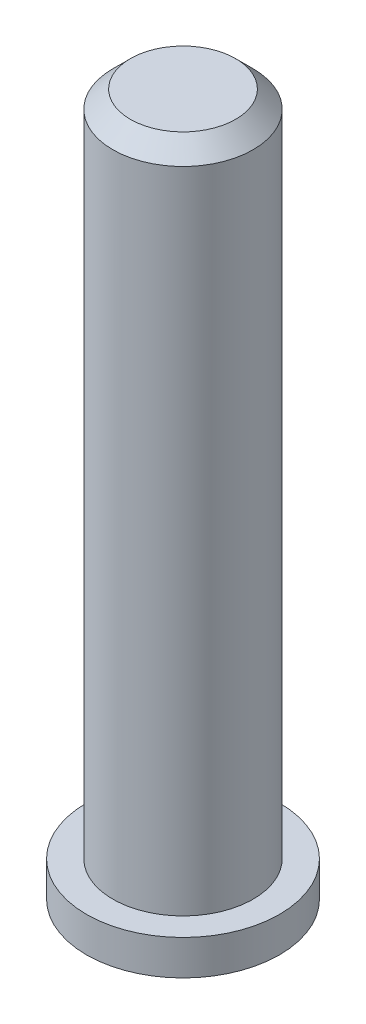
ISO-10303-21;
HEADER;
FILE_DESCRIPTION(('STEP AP214'),'2;1');
FILE_NAME('part.step','',(''),(''),'','','');
FILE_SCHEMA(('AUTOMOTIVE_DESIGN { 1 0 10303 214 1 1 1 1 }'));
ENDSEC;
DATA;
#1=APPLICATION_CONTEXT('core data for automotive mechanical design processes');
#2=APPLICATION_PROTOCOL_DEFINITION('international standard','automotive_design',2000,#1);
#3=PRODUCT_CONTEXT('',#1,'mechanical');
#4=PRODUCT('Part','Part','',(#3));
#5=PRODUCT_RELATED_PRODUCT_CATEGORY('part','',(#4));
#6=PRODUCT_DEFINITION_FORMATION('','',#4);
#7=PRODUCT_DEFINITION_CONTEXT('part definition',#1,'design');
#8=PRODUCT_DEFINITION('design','',#6,#7);
#9=PRODUCT_DEFINITION_SHAPE('','',#8);
#10=(LENGTH_UNIT() NAMED_UNIT(*) SI_UNIT(.MILLI.,.METRE.));
#11=(NAMED_UNIT(*) PLANE_ANGLE_UNIT() SI_UNIT($,.RADIAN.));
#12=(NAMED_UNIT(*) SI_UNIT($,.STERADIAN.) SOLID_ANGLE_UNIT());
#13=UNCERTAINTY_MEASURE_WITH_UNIT(LENGTH_MEASURE(1.E-05),#10,'distance_accuracy_value','');
#14=(GEOMETRIC_REPRESENTATION_CONTEXT(3) GLOBAL_UNCERTAINTY_ASSIGNED_CONTEXT((#13)) GLOBAL_UNIT_ASSIGNED_CONTEXT((#10,
#11,#12)) REPRESENTATION_CONTEXT('',''));
#15=CARTESIAN_POINT('',(0.,0.,0.));
#16=DIRECTION('',(0.,0.,1.));
#17=DIRECTION('',(1.,0.,0.));
#18=AXIS2_PLACEMENT_3D('',#15,#16,#17);
#19=CARTESIAN_POINT('',(0.,0.,0.));
#20=DIRECTION('',(0.,1.,0.));
#21=DIRECTION('',(0.,0.,1.));
#22=AXIS2_PLACEMENT_3D('',#19,#20,#21);
#23=PLANE('',#22);
#24=CARTESIAN_POINT('',(0.,0.,0.));
#25=DIRECTION('',(0.,-1.,0.));
#26=DIRECTION('',(0.,0.,-1.));
#27=AXIS2_PLACEMENT_3D('',#24,#25,#26);
#28=CIRCLE('',#27,2.75);
#29=CARTESIAN_POINT('',(0.,0.,-2.75));
#30=VERTEX_POINT('',#29);
#31=EDGE_CURVE('E49',#30,#30,#28,.T.);
#32=ORIENTED_EDGE('',*,*,#31,.T.);
#33=EDGE_LOOP('',(#32));
#34=FACE_BOUND('',#33,.T.);
#35=CARTESIAN_POINT('',(0.,0.,0.));
#36=DIRECTION('',(0.,1.,0.));
#37=DIRECTION('',(0.,0.,1.));
#38=AXIS2_PLACEMENT_3D('',#35,#36,#37);
#39=CIRCLE('',#38,0.325);
#40=CARTESIAN_POINT('',(0.,0.,0.325));
#41=VERTEX_POINT('',#40);
#42=EDGE_CURVE('E10',#41,#41,#39,.F.);
#43=ORIENTED_EDGE('',*,*,#42,.F.);
#44=EDGE_LOOP('',(#43));
#45=FACE_BOUND('',#44,.T.);
#46=ADVANCED_FACE('F26',(#34,#45),#23,.F.);
#47=CARTESIAN_POINT('',(0.,20.,0.));
#48=DIRECTION('',(0.,-1.,0.));
#49=DIRECTION('',(0.,0.,-1.));
#50=AXIS2_PLACEMENT_3D('',#47,#48,#49);
#51=CYLINDRICAL_SURFACE('',#50,2.);
#52=CARTESIAN_POINT('',(0.,19.5,0.));
#53=DIRECTION('',(0.,1.,0.));
#54=DIRECTION('',(0.,0.,1.));
#55=AXIS2_PLACEMENT_3D('',#52,#53,#54);
#56=CIRCLE('',#55,2.);
#57=CARTESIAN_POINT('',(0.,19.5,2.));
#58=VERTEX_POINT('',#57);
#59=EDGE_CURVE('E37',#58,#58,#56,.F.);
#60=ORIENTED_EDGE('',*,*,#59,.T.);
#61=EDGE_LOOP('',(#60));
#62=FACE_BOUND('',#61,.T.);
#63=CARTESIAN_POINT('',(0.,1.,0.));
#64=DIRECTION('',(0.,-1.,0.));
#65=DIRECTION('',(0.,0.,-1.));
#66=AXIS2_PLACEMENT_3D('',#63,#64,#65);
#67=CIRCLE('',#66,2.);
#68=CARTESIAN_POINT('',(0.,1.,-2.));
#69=VERTEX_POINT('',#68);
#70=EDGE_CURVE('E33',#69,#69,#67,.T.);
#71=ORIENTED_EDGE('',*,*,#70,.F.);
#72=EDGE_LOOP('',(#71));
#73=FACE_BOUND('',#72,.T.);
#74=ADVANCED_FACE('F28',(#62,#73),#51,.T.);
#75=CARTESIAN_POINT('',(0.,20.,0.));
#76=DIRECTION('',(0.,1.,0.));
#77=DIRECTION('',(0.,0.,1.));
#78=AXIS2_PLACEMENT_3D('',#75,#76,#77);
#79=PLANE('',#78);
#80=CARTESIAN_POINT('',(0.,20.,0.));
#81=DIRECTION('',(0.,1.,0.));
#82=DIRECTION('',(0.,0.,1.));
#83=AXIS2_PLACEMENT_3D('',#80,#81,#82);
#84=CIRCLE('',#83,1.5);
#85=CARTESIAN_POINT('',(0.,20.,1.5));
#86=VERTEX_POINT('',#85);
#87=EDGE_CURVE('E41',#86,#86,#84,.T.);
#88=ORIENTED_EDGE('',*,*,#87,.T.);
#89=EDGE_LOOP('',(#88));
#90=FACE_BOUND('',#89,.T.);
#91=ADVANCED_FACE('F77',(#90),#79,.T.);
#92=CARTESIAN_POINT('',(0.,20.,0.));
#93=DIRECTION('',(0.,-1.,0.));
#94=DIRECTION('',(0.,0.,-1.));
#95=AXIS2_PLACEMENT_3D('',#92,#93,#94);
#96=CONICAL_SURFACE('',#95,1.5,0.785398163397445);
#97=ORIENTED_EDGE('',*,*,#59,.F.);
#98=EDGE_LOOP('',(#97));
#99=FACE_BOUND('',#98,.T.);
#100=ORIENTED_EDGE('',*,*,#87,.F.);
#101=EDGE_LOOP('',(#100));
#102=FACE_BOUND('',#101,.T.);
#103=ADVANCED_FACE('F81',(#99,#102),#96,.T.);
#104=CARTESIAN_POINT('',(0.,1.,0.));
#105=DIRECTION('',(0.,-1.,0.));
#106=DIRECTION('',(0.,0.,-1.));
#107=AXIS2_PLACEMENT_3D('',#104,#105,#106);
#108=PLANE('',#107);
#109=CARTESIAN_POINT('',(0.,1.,0.));
#110=DIRECTION('',(0.,-1.,0.));
#111=DIRECTION('',(0.,0.,-1.));
#112=AXIS2_PLACEMENT_3D('',#109,#110,#111);
#113=CIRCLE('',#112,2.75);
#114=CARTESIAN_POINT('',(0.,1.,-2.75));
#115=VERTEX_POINT('',#114);
#116=EDGE_CURVE('E46',#115,#115,#113,.T.);
#117=ORIENTED_EDGE('',*,*,#116,.F.);
#118=EDGE_LOOP('',(#117));
#119=FACE_BOUND('',#118,.T.);
#120=ORIENTED_EDGE('',*,*,#70,.T.);
#121=EDGE_LOOP('',(#120));
#122=FACE_BOUND('',#121,.T.);
#123=ADVANCED_FACE('F68',(#119,#122),#108,.F.);
#124=CARTESIAN_POINT('',(0.,1.,0.));
#125=DIRECTION('',(0.,-1.,0.));
#126=DIRECTION('',(0.,0.,-1.));
#127=AXIS2_PLACEMENT_3D('',#124,#125,#126);
#128=CYLINDRICAL_SURFACE('',#127,2.75);
#129=ORIENTED_EDGE('',*,*,#116,.T.);
#130=EDGE_LOOP('',(#129));
#131=FACE_BOUND('',#130,.T.);
#132=ORIENTED_EDGE('',*,*,#31,.F.);
#133=EDGE_LOOP('',(#132));
#134=FACE_BOUND('',#133,.T.);
#135=ADVANCED_FACE('F60',(#131,#134),#128,.T.);
#136=CARTESIAN_POINT('',(0.,-0.55,0.));
#137=DIRECTION('',(0.,1.,0.));
#138=DIRECTION('',(0.,0.,1.));
#139=AXIS2_PLACEMENT_3D('',#136,#137,#138);
#140=CYLINDRICAL_SURFACE('',#139,0.325);
#141=CARTESIAN_POINT('',(0.,-0.55,0.));
#142=DIRECTION('',(0.,-1.,0.));
#143=DIRECTION('',(0.,0.,-1.));
#144=AXIS2_PLACEMENT_3D('',#141,#142,#143);
#145=CIRCLE('',#144,0.325);
#146=CARTESIAN_POINT('',(0.,-0.55,-0.325));
#147=VERTEX_POINT('',#146);
#148=EDGE_CURVE('E52',#147,#147,#145,.T.);
#149=ORIENTED_EDGE('',*,*,#148,.F.);
#150=EDGE_LOOP('',(#149));
#151=FACE_BOUND('',#150,.T.);
#152=ORIENTED_EDGE('',*,*,#42,.T.);
#153=EDGE_LOOP('',(#152));
#154=FACE_BOUND('',#153,.T.);
#155=ADVANCED_FACE('F58',(#151,#154),#140,.T.);
#156=CARTESIAN_POINT('',(0.,-0.55,0.));
#157=DIRECTION('',(0.,-1.,0.));
#158=DIRECTION('',(0.,0.,-1.));
#159=AXIS2_PLACEMENT_3D('',#156,#157,#158);
#160=PLANE('',#159);
#161=ORIENTED_EDGE('',*,*,#148,.T.);
#162=EDGE_LOOP('',(#161));
#163=FACE_BOUND('',#162,.T.);
#164=ADVANCED_FACE('F56',(#163),#160,.T.);
#165=CLOSED_SHELL('',(#46,#74,#91,#103,#123,#135,#155,#164));
#166=MANIFOLD_SOLID_BREP('B2',#165);
#167=ADVANCED_BREP_SHAPE_REPRESENTATION('',(#18,#166),#14);
#168=SHAPE_DEFINITION_REPRESENTATION(#9,#167);
ENDSEC;
END-ISO-10303-21;
